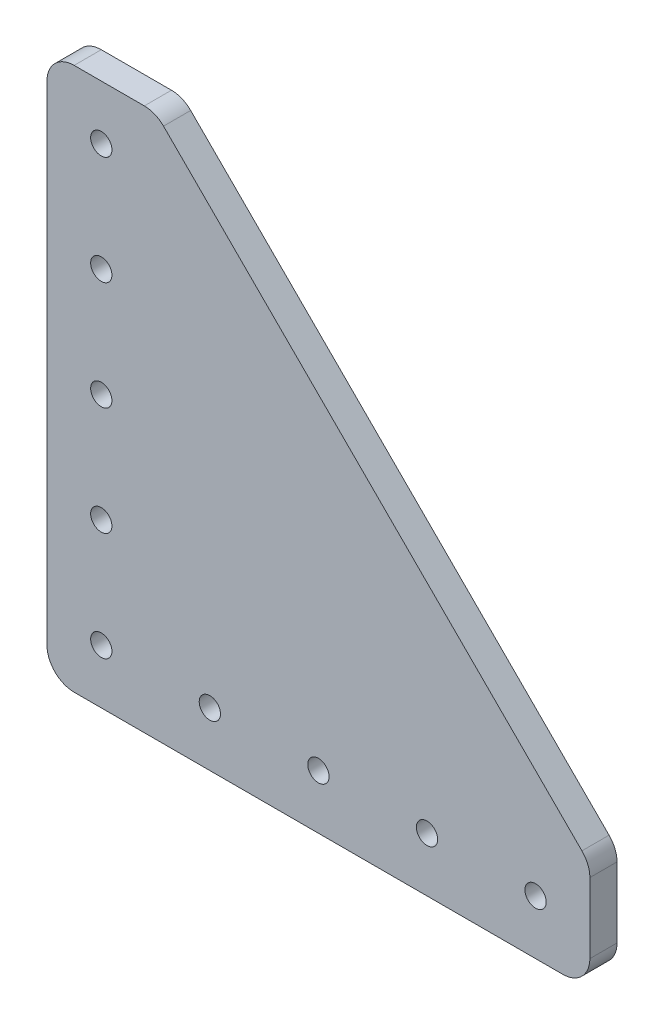
ISO-10303-21;
HEADER;
FILE_DESCRIPTION(('STEP AP214'),'2;1');
FILE_NAME('part.step','',(''),(''),'','','');
FILE_SCHEMA(('AUTOMOTIVE_DESIGN { 1 0 10303 214 1 1 1 1 }'));
ENDSEC;
DATA;
#1=APPLICATION_CONTEXT('core data for automotive mechanical design processes');
#2=APPLICATION_PROTOCOL_DEFINITION('international standard','automotive_design',2000,#1);
#3=PRODUCT_CONTEXT('',#1,'mechanical');
#4=PRODUCT('Part','Part','',(#3));
#5=PRODUCT_RELATED_PRODUCT_CATEGORY('part','',(#4));
#6=PRODUCT_DEFINITION_FORMATION('','',#4);
#7=PRODUCT_DEFINITION_CONTEXT('part definition',#1,'design');
#8=PRODUCT_DEFINITION('design','',#6,#7);
#9=PRODUCT_DEFINITION_SHAPE('','',#8);
#10=(LENGTH_UNIT() NAMED_UNIT(*) SI_UNIT(.MILLI.,.METRE.));
#11=(NAMED_UNIT(*) PLANE_ANGLE_UNIT() SI_UNIT($,.RADIAN.));
#12=(NAMED_UNIT(*) SI_UNIT($,.STERADIAN.) SOLID_ANGLE_UNIT());
#13=UNCERTAINTY_MEASURE_WITH_UNIT(LENGTH_MEASURE(1.E-05),#10,'distance_accuracy_value','');
#14=(GEOMETRIC_REPRESENTATION_CONTEXT(3) GLOBAL_UNCERTAINTY_ASSIGNED_CONTEXT((#13)) GLOBAL_UNIT_ASSIGNED_CONTEXT((#10,
#11,#12)) REPRESENTATION_CONTEXT('',''));
#15=CARTESIAN_POINT('',(0.,0.,0.));
#16=DIRECTION('',(0.,0.,1.));
#17=DIRECTION('',(1.,0.,0.));
#18=AXIS2_PLACEMENT_3D('',#15,#16,#17);
#19=CARTESIAN_POINT('',(127.,0.,6.35));
#20=DIRECTION('',(1.,0.,0.));
#21=DIRECTION('',(0.,0.,-1.));
#22=AXIS2_PLACEMENT_3D('',#19,#20,#21);
#23=PLANE('',#22);
#24=DIRECTION('',(0.,-1.,0.));
#25=VECTOR('',#24,1.);
#26=CARTESIAN_POINT('',(127.,0.,6.35));
#27=LINE('',#26,#25);
#28=CARTESIAN_POINT('',(127.,22.7697438789308,6.35));
#29=VERTEX_POINT('',#28);
#30=CARTESIAN_POINT('',(127.,6.34999999999999,6.35));
#31=VERTEX_POINT('',#30);
#32=EDGE_CURVE('E186',#29,#31,#27,.T.);
#33=ORIENTED_EDGE('',*,*,#32,.T.);
#34=DIRECTION('',(0.,0.,-1.));
#35=VECTOR('',#34,1.);
#36=CARTESIAN_POINT('',(127.,6.34999999999999,6.35));
#37=LINE('',#36,#35);
#38=CARTESIAN_POINT('',(127.,6.34999999999999,0.));
#39=VERTEX_POINT('',#38);
#40=EDGE_CURVE('E129',#31,#39,#37,.T.);
#41=ORIENTED_EDGE('',*,*,#40,.T.);
#42=DIRECTION('',(0.,-1.,0.));
#43=VECTOR('',#42,1.);
#44=CARTESIAN_POINT('',(127.,0.,0.));
#45=LINE('',#44,#43);
#46=CARTESIAN_POINT('',(127.,22.7697438789308,0.));
#47=VERTEX_POINT('',#46);
#48=EDGE_CURVE('E121',#47,#39,#45,.T.);
#49=ORIENTED_EDGE('',*,*,#48,.F.);
#50=DIRECTION('',(0.,0.,-1.));
#51=VECTOR('',#50,1.);
#52=CARTESIAN_POINT('',(127.,22.7697438789308,6.35));
#53=LINE('',#52,#51);
#54=EDGE_CURVE('E134',#47,#29,#53,.F.);
#55=ORIENTED_EDGE('',*,*,#54,.T.);
#56=EDGE_LOOP('',(#33,#41,#49,#55));
#57=FACE_BOUND('',#56,.T.);
#58=ADVANCED_FACE('F39',(#57),#23,.T.);
#59=CARTESIAN_POINT('',(76.2,76.2,6.35));
#60=DIRECTION('',(0.707106781186547,0.707106781186548,0.));
#61=DIRECTION('',(-0.707106781186548,0.707106781186547,0.));
#62=AXIS2_PLACEMENT_3D('',#59,#60,#61);
#63=PLANE('',#62);
#64=DIRECTION('',(0.707106781186548,-0.707106781186547,0.));
#65=VECTOR('',#64,1.);
#66=CARTESIAN_POINT('',(76.2,76.2,0.));
#67=LINE('',#66,#65);
#68=CARTESIAN_POINT('',(27.2598719394654,125.140128060535,0.));
#69=VERTEX_POINT('',#68);
#70=CARTESIAN_POINT('',(125.140128060535,27.2598719394654,0.));
#71=VERTEX_POINT('',#70);
#72=EDGE_CURVE('E123',#69,#71,#67,.T.);
#73=ORIENTED_EDGE('',*,*,#72,.F.);
#74=DIRECTION('',(0.,0.,-1.));
#75=VECTOR('',#74,1.);
#76=CARTESIAN_POINT('',(27.2598719394654,125.140128060535,6.35));
#77=LINE('',#76,#75);
#78=CARTESIAN_POINT('',(27.2598719394654,125.140128060535,6.35));
#79=VERTEX_POINT('',#78);
#80=EDGE_CURVE('E11',#69,#79,#77,.F.);
#81=ORIENTED_EDGE('',*,*,#80,.T.);
#82=DIRECTION('',(0.707106781186548,-0.707106781186547,0.));
#83=VECTOR('',#82,1.);
#84=CARTESIAN_POINT('',(76.2,76.2,6.35));
#85=LINE('',#84,#83);
#86=CARTESIAN_POINT('',(125.140128060535,27.2598719394654,6.35));
#87=VERTEX_POINT('',#86);
#88=EDGE_CURVE('E183',#79,#87,#85,.T.);
#89=ORIENTED_EDGE('',*,*,#88,.T.);
#90=DIRECTION('',(0.,0.,-1.));
#91=VECTOR('',#90,1.);
#92=CARTESIAN_POINT('',(125.140128060535,27.2598719394654,6.35));
#93=LINE('',#92,#91);
#94=EDGE_CURVE('E47',#87,#71,#93,.T.);
#95=ORIENTED_EDGE('',*,*,#94,.T.);
#96=EDGE_LOOP('',(#73,#81,#89,#95));
#97=FACE_BOUND('',#96,.T.);
#98=ADVANCED_FACE('F180',(#97),#63,.T.);
#99=CARTESIAN_POINT('',(1.38777878078145E-13,127.,6.35));
#100=DIRECTION('',(0.,1.,0.));
#101=DIRECTION('',(-1.,0.,0.));
#102=AXIS2_PLACEMENT_3D('',#99,#100,#101);
#103=PLANE('',#102);
#104=DIRECTION('',(1.,0.,0.));
#105=VECTOR('',#104,1.);
#106=CARTESIAN_POINT('',(1.38777878078145E-13,127.,0.));
#107=LINE('',#106,#105);
#108=CARTESIAN_POINT('',(6.34999999999998,127.,0.));
#109=VERTEX_POINT('',#108);
#110=CARTESIAN_POINT('',(22.7697438789308,127.,0.));
#111=VERTEX_POINT('',#110);
#112=EDGE_CURVE('E221',#109,#111,#107,.T.);
#113=ORIENTED_EDGE('',*,*,#112,.F.);
#114=DIRECTION('',(0.,0.,-1.));
#115=VECTOR('',#114,1.);
#116=CARTESIAN_POINT('',(6.34999999999998,127.,6.35));
#117=LINE('',#116,#115);
#118=CARTESIAN_POINT('',(6.34999999999998,127.,6.35));
#119=VERTEX_POINT('',#118);
#120=EDGE_CURVE('E177',#109,#119,#117,.F.);
#121=ORIENTED_EDGE('',*,*,#120,.T.);
#122=DIRECTION('',(1.,0.,0.));
#123=VECTOR('',#122,1.);
#124=CARTESIAN_POINT('',(1.38777878078145E-13,127.,6.35));
#125=LINE('',#124,#123);
#126=CARTESIAN_POINT('',(22.7697438789308,127.,6.35));
#127=VERTEX_POINT('',#126);
#128=EDGE_CURVE('E185',#119,#127,#125,.T.);
#129=ORIENTED_EDGE('',*,*,#128,.T.);
#130=DIRECTION('',(0.,0.,-1.));
#131=VECTOR('',#130,1.);
#132=CARTESIAN_POINT('',(22.7697438789308,127.,6.35));
#133=LINE('',#132,#131);
#134=EDGE_CURVE('E174',#127,#111,#133,.T.);
#135=ORIENTED_EDGE('',*,*,#134,.T.);
#136=EDGE_LOOP('',(#113,#121,#129,#135));
#137=FACE_BOUND('',#136,.T.);
#138=ADVANCED_FACE('F279',(#137),#103,.T.);
#139=CARTESIAN_POINT('',(0.,0.,6.35));
#140=DIRECTION('',(-1.,0.,0.));
#141=DIRECTION('',(0.,-1.,0.));
#142=AXIS2_PLACEMENT_3D('',#139,#140,#141);
#143=PLANE('',#142);
#144=DIRECTION('',(0.,1.,0.));
#145=VECTOR('',#144,1.);
#146=CARTESIAN_POINT('',(0.,0.,0.));
#147=LINE('',#146,#145);
#148=CARTESIAN_POINT('',(0.,6.35,0.));
#149=VERTEX_POINT('',#148);
#150=CARTESIAN_POINT('',(0.,120.65,0.));
#151=VERTEX_POINT('',#150);
#152=EDGE_CURVE('E224',#149,#151,#147,.T.);
#153=ORIENTED_EDGE('',*,*,#152,.F.);
#154=DIRECTION('',(0.,0.,-1.));
#155=VECTOR('',#154,1.);
#156=CARTESIAN_POINT('',(0.,6.35,6.35));
#157=LINE('',#156,#155);
#158=CARTESIAN_POINT('',(0.,6.35,6.35));
#159=VERTEX_POINT('',#158);
#160=EDGE_CURVE('E61',#149,#159,#157,.F.);
#161=ORIENTED_EDGE('',*,*,#160,.T.);
#162=DIRECTION('',(0.,1.,0.));
#163=VECTOR('',#162,1.);
#164=CARTESIAN_POINT('',(0.,0.,6.35));
#165=LINE('',#164,#163);
#166=CARTESIAN_POINT('',(0.,120.65,6.35));
#167=VERTEX_POINT('',#166);
#168=EDGE_CURVE('E189',#159,#167,#165,.T.);
#169=ORIENTED_EDGE('',*,*,#168,.T.);
#170=DIRECTION('',(0.,0.,-1.));
#171=VECTOR('',#170,1.);
#172=CARTESIAN_POINT('',(0.,120.65,6.35));
#173=LINE('',#172,#171);
#174=EDGE_CURVE('E170',#167,#151,#173,.T.);
#175=ORIENTED_EDGE('',*,*,#174,.T.);
#176=EDGE_LOOP('',(#153,#161,#169,#175));
#177=FACE_BOUND('',#176,.T.);
#178=ADVANCED_FACE('F307',(#177),#143,.T.);
#179=CARTESIAN_POINT('',(38.1,12.7,6.35));
#180=DIRECTION('',(0.,0.,-1.));
#181=DIRECTION('',(-1.,0.,0.));
#182=AXIS2_PLACEMENT_3D('',#179,#180,#181);
#183=CYLINDRICAL_SURFACE('',#182,2.4892);
#184=CARTESIAN_POINT('',(38.1,12.7,6.35));
#185=DIRECTION('',(0.,0.,1.));
#186=DIRECTION('',(1.,0.,0.));
#187=AXIS2_PLACEMENT_3D('',#184,#185,#186);
#188=CIRCLE('',#187,2.4892);
#189=CARTESIAN_POINT('',(40.5892,12.7,6.35));
#190=VERTEX_POINT('',#189);
#191=EDGE_CURVE('E144',#190,#190,#188,.T.);
#192=ORIENTED_EDGE('',*,*,#191,.T.);
#193=EDGE_LOOP('',(#192));
#194=FACE_BOUND('',#193,.T.);
#195=CARTESIAN_POINT('',(38.1,12.7,0.));
#196=DIRECTION('',(0.,0.,1.));
#197=DIRECTION('',(1.,0.,0.));
#198=AXIS2_PLACEMENT_3D('',#195,#196,#197);
#199=CIRCLE('',#198,2.4892);
#200=CARTESIAN_POINT('',(40.5892,12.7,0.));
#201=VERTEX_POINT('',#200);
#202=EDGE_CURVE('E250',#201,#201,#199,.T.);
#203=ORIENTED_EDGE('',*,*,#202,.F.);
#204=EDGE_LOOP('',(#203));
#205=FACE_BOUND('',#204,.T.);
#206=ADVANCED_FACE('F314',(#194,#205),#183,.F.);
#207=CARTESIAN_POINT('',(63.5,12.7,6.35));
#208=DIRECTION('',(0.,0.,-1.));
#209=DIRECTION('',(-1.,0.,0.));
#210=AXIS2_PLACEMENT_3D('',#207,#208,#209);
#211=CYLINDRICAL_SURFACE('',#210,2.4892);
#212=CARTESIAN_POINT('',(63.5,12.7,6.35));
#213=DIRECTION('',(0.,0.,1.));
#214=DIRECTION('',(1.,0.,0.));
#215=AXIS2_PLACEMENT_3D('',#212,#213,#214);
#216=CIRCLE('',#215,2.4892);
#217=CARTESIAN_POINT('',(65.9892,12.7,6.35));
#218=VERTEX_POINT('',#217);
#219=EDGE_CURVE('E215',#218,#218,#216,.T.);
#220=ORIENTED_EDGE('',*,*,#219,.T.);
#221=EDGE_LOOP('',(#220));
#222=FACE_BOUND('',#221,.T.);
#223=CARTESIAN_POINT('',(63.5,12.7,0.));
#224=DIRECTION('',(0.,0.,1.));
#225=DIRECTION('',(1.,0.,0.));
#226=AXIS2_PLACEMENT_3D('',#223,#224,#225);
#227=CIRCLE('',#226,2.4892);
#228=CARTESIAN_POINT('',(65.9892,12.7,0.));
#229=VERTEX_POINT('',#228);
#230=EDGE_CURVE('E248',#229,#229,#227,.T.);
#231=ORIENTED_EDGE('',*,*,#230,.F.);
#232=EDGE_LOOP('',(#231));
#233=FACE_BOUND('',#232,.T.);
#234=ADVANCED_FACE('F320',(#222,#233),#211,.F.);
#235=CARTESIAN_POINT('',(12.7,38.1,6.35));
#236=DIRECTION('',(0.,0.,-1.));
#237=DIRECTION('',(-1.,0.,0.));
#238=AXIS2_PLACEMENT_3D('',#235,#236,#237);
#239=CYLINDRICAL_SURFACE('',#238,2.4892);
#240=CARTESIAN_POINT('',(12.7,38.1,6.35));
#241=DIRECTION('',(0.,0.,1.));
#242=DIRECTION('',(1.,0.,0.));
#243=AXIS2_PLACEMENT_3D('',#240,#241,#242);
#244=CIRCLE('',#243,2.4892);
#245=CARTESIAN_POINT('',(15.1892,38.1,6.35));
#246=VERTEX_POINT('',#245);
#247=EDGE_CURVE('E212',#246,#246,#244,.T.);
#248=ORIENTED_EDGE('',*,*,#247,.T.);
#249=EDGE_LOOP('',(#248));
#250=FACE_BOUND('',#249,.T.);
#251=CARTESIAN_POINT('',(12.7,38.1,0.));
#252=DIRECTION('',(0.,0.,1.));
#253=DIRECTION('',(1.,0.,0.));
#254=AXIS2_PLACEMENT_3D('',#251,#252,#253);
#255=CIRCLE('',#254,2.4892);
#256=CARTESIAN_POINT('',(15.1892,38.1,0.));
#257=VERTEX_POINT('',#256);
#258=EDGE_CURVE('E245',#257,#257,#255,.T.);
#259=ORIENTED_EDGE('',*,*,#258,.F.);
#260=EDGE_LOOP('',(#259));
#261=FACE_BOUND('',#260,.T.);
#262=ADVANCED_FACE('F341',(#250,#261),#239,.F.);
#263=CARTESIAN_POINT('',(12.7,63.5,6.35));
#264=DIRECTION('',(0.,0.,-1.));
#265=DIRECTION('',(-1.,0.,0.));
#266=AXIS2_PLACEMENT_3D('',#263,#264,#265);
#267=CYLINDRICAL_SURFACE('',#266,2.4892);
#268=CARTESIAN_POINT('',(12.7,63.5,6.35));
#269=DIRECTION('',(0.,0.,1.));
#270=DIRECTION('',(1.,0.,0.));
#271=AXIS2_PLACEMENT_3D('',#268,#269,#270);
#272=CIRCLE('',#271,2.4892);
#273=CARTESIAN_POINT('',(15.1892,63.5,6.35));
#274=VERTEX_POINT('',#273);
#275=EDGE_CURVE('E209',#274,#274,#272,.T.);
#276=ORIENTED_EDGE('',*,*,#275,.T.);
#277=EDGE_LOOP('',(#276));
#278=FACE_BOUND('',#277,.T.);
#279=CARTESIAN_POINT('',(12.7,63.5,0.));
#280=DIRECTION('',(0.,0.,1.));
#281=DIRECTION('',(1.,0.,0.));
#282=AXIS2_PLACEMENT_3D('',#279,#280,#281);
#283=CIRCLE('',#282,2.4892);
#284=CARTESIAN_POINT('',(15.1892,63.5,0.));
#285=VERTEX_POINT('',#284);
#286=EDGE_CURVE('E242',#285,#285,#283,.T.);
#287=ORIENTED_EDGE('',*,*,#286,.F.);
#288=EDGE_LOOP('',(#287));
#289=FACE_BOUND('',#288,.T.);
#290=ADVANCED_FACE('F337',(#278,#289),#267,.F.);
#291=CARTESIAN_POINT('',(12.7,88.9,6.35));
#292=DIRECTION('',(0.,0.,-1.));
#293=DIRECTION('',(-1.,0.,0.));
#294=AXIS2_PLACEMENT_3D('',#291,#292,#293);
#295=CYLINDRICAL_SURFACE('',#294,2.4892);
#296=CARTESIAN_POINT('',(12.7,88.9,6.35));
#297=DIRECTION('',(0.,0.,1.));
#298=DIRECTION('',(1.,0.,0.));
#299=AXIS2_PLACEMENT_3D('',#296,#297,#298);
#300=CIRCLE('',#299,2.4892);
#301=CARTESIAN_POINT('',(15.1892,88.9,6.35));
#302=VERTEX_POINT('',#301);
#303=EDGE_CURVE('E206',#302,#302,#300,.T.);
#304=ORIENTED_EDGE('',*,*,#303,.T.);
#305=EDGE_LOOP('',(#304));
#306=FACE_BOUND('',#305,.T.);
#307=CARTESIAN_POINT('',(12.7,88.9,0.));
#308=DIRECTION('',(0.,0.,1.));
#309=DIRECTION('',(1.,0.,0.));
#310=AXIS2_PLACEMENT_3D('',#307,#308,#309);
#311=CIRCLE('',#310,2.4892);
#312=CARTESIAN_POINT('',(15.1892,88.9,0.));
#313=VERTEX_POINT('',#312);
#314=EDGE_CURVE('E239',#313,#313,#311,.T.);
#315=ORIENTED_EDGE('',*,*,#314,.F.);
#316=EDGE_LOOP('',(#315));
#317=FACE_BOUND('',#316,.T.);
#318=ADVANCED_FACE('F333',(#306,#317),#295,.F.);
#319=CARTESIAN_POINT('',(12.7,114.3,6.35));
#320=DIRECTION('',(0.,0.,-1.));
#321=DIRECTION('',(-1.,0.,0.));
#322=AXIS2_PLACEMENT_3D('',#319,#320,#321);
#323=CYLINDRICAL_SURFACE('',#322,2.4892);
#324=CARTESIAN_POINT('',(12.7,114.3,6.35));
#325=DIRECTION('',(0.,0.,1.));
#326=DIRECTION('',(1.,0.,0.));
#327=AXIS2_PLACEMENT_3D('',#324,#325,#326);
#328=CIRCLE('',#327,2.4892);
#329=CARTESIAN_POINT('',(15.1892,114.3,6.35));
#330=VERTEX_POINT('',#329);
#331=EDGE_CURVE('E203',#330,#330,#328,.T.);
#332=ORIENTED_EDGE('',*,*,#331,.T.);
#333=EDGE_LOOP('',(#332));
#334=FACE_BOUND('',#333,.T.);
#335=CARTESIAN_POINT('',(12.7,114.3,0.));
#336=DIRECTION('',(0.,0.,1.));
#337=DIRECTION('',(1.,0.,0.));
#338=AXIS2_PLACEMENT_3D('',#335,#336,#337);
#339=CIRCLE('',#338,2.4892);
#340=CARTESIAN_POINT('',(15.1892,114.3,0.));
#341=VERTEX_POINT('',#340);
#342=EDGE_CURVE('E236',#341,#341,#339,.T.);
#343=ORIENTED_EDGE('',*,*,#342,.F.);
#344=EDGE_LOOP('',(#343));
#345=FACE_BOUND('',#344,.T.);
#346=ADVANCED_FACE('F329',(#334,#345),#323,.F.);
#347=CARTESIAN_POINT('',(88.9,12.7,6.35));
#348=DIRECTION('',(0.,0.,-1.));
#349=DIRECTION('',(-1.,0.,0.));
#350=AXIS2_PLACEMENT_3D('',#347,#348,#349);
#351=CYLINDRICAL_SURFACE('',#350,2.4892);
#352=CARTESIAN_POINT('',(88.9,12.7,6.35));
#353=DIRECTION('',(0.,0.,1.));
#354=DIRECTION('',(1.,0.,0.));
#355=AXIS2_PLACEMENT_3D('',#352,#353,#354);
#356=CIRCLE('',#355,2.4892);
#357=CARTESIAN_POINT('',(91.3892,12.7,6.35));
#358=VERTEX_POINT('',#357);
#359=EDGE_CURVE('E200',#358,#358,#356,.T.);
#360=ORIENTED_EDGE('',*,*,#359,.T.);
#361=EDGE_LOOP('',(#360));
#362=FACE_BOUND('',#361,.T.);
#363=CARTESIAN_POINT('',(88.9,12.7,0.));
#364=DIRECTION('',(0.,0.,1.));
#365=DIRECTION('',(1.,0.,0.));
#366=AXIS2_PLACEMENT_3D('',#363,#364,#365);
#367=CIRCLE('',#366,2.4892);
#368=CARTESIAN_POINT('',(91.3892,12.7,0.));
#369=VERTEX_POINT('',#368);
#370=EDGE_CURVE('E233',#369,#369,#367,.T.);
#371=ORIENTED_EDGE('',*,*,#370,.F.);
#372=EDGE_LOOP('',(#371));
#373=FACE_BOUND('',#372,.T.);
#374=ADVANCED_FACE('F325',(#362,#373),#351,.F.);
#375=CARTESIAN_POINT('',(114.3,12.7,6.35));
#376=DIRECTION('',(0.,0.,-1.));
#377=DIRECTION('',(-1.,0.,0.));
#378=AXIS2_PLACEMENT_3D('',#375,#376,#377);
#379=CYLINDRICAL_SURFACE('',#378,2.4892);
#380=CARTESIAN_POINT('',(114.3,12.7,6.35));
#381=DIRECTION('',(0.,0.,1.));
#382=DIRECTION('',(1.,0.,0.));
#383=AXIS2_PLACEMENT_3D('',#380,#381,#382);
#384=CIRCLE('',#383,2.4892);
#385=CARTESIAN_POINT('',(116.7892,12.7,6.35));
#386=VERTEX_POINT('',#385);
#387=EDGE_CURVE('E197',#386,#386,#384,.T.);
#388=ORIENTED_EDGE('',*,*,#387,.T.);
#389=EDGE_LOOP('',(#388));
#390=FACE_BOUND('',#389,.T.);
#391=CARTESIAN_POINT('',(114.3,12.7,0.));
#392=DIRECTION('',(0.,0.,1.));
#393=DIRECTION('',(1.,0.,0.));
#394=AXIS2_PLACEMENT_3D('',#391,#392,#393);
#395=CIRCLE('',#394,2.4892);
#396=CARTESIAN_POINT('',(116.7892,12.7,0.));
#397=VERTEX_POINT('',#396);
#398=EDGE_CURVE('E230',#397,#397,#395,.T.);
#399=ORIENTED_EDGE('',*,*,#398,.F.);
#400=EDGE_LOOP('',(#399));
#401=FACE_BOUND('',#400,.T.);
#402=ADVANCED_FACE('F269',(#390,#401),#379,.F.);
#403=CARTESIAN_POINT('',(0.,0.,6.35));
#404=DIRECTION('',(0.,-1.,0.));
#405=DIRECTION('',(1.,0.,0.));
#406=AXIS2_PLACEMENT_3D('',#403,#404,#405);
#407=PLANE('',#406);
#408=DIRECTION('',(-1.,0.,0.));
#409=VECTOR('',#408,1.);
#410=CARTESIAN_POINT('',(0.,0.,0.));
#411=LINE('',#410,#409);
#412=CARTESIAN_POINT('',(120.65,0.,0.));
#413=VERTEX_POINT('',#412);
#414=CARTESIAN_POINT('',(6.35,0.,0.));
#415=VERTEX_POINT('',#414);
#416=EDGE_CURVE('E227',#413,#415,#411,.T.);
#417=ORIENTED_EDGE('',*,*,#416,.F.);
#418=DIRECTION('',(0.,0.,-1.));
#419=VECTOR('',#418,1.);
#420=CARTESIAN_POINT('',(120.65,0.,6.35));
#421=LINE('',#420,#419);
#422=CARTESIAN_POINT('',(120.65,0.,6.35));
#423=VERTEX_POINT('',#422);
#424=EDGE_CURVE('E160',#413,#423,#421,.F.);
#425=ORIENTED_EDGE('',*,*,#424,.T.);
#426=DIRECTION('',(-1.,0.,0.));
#427=VECTOR('',#426,1.);
#428=CARTESIAN_POINT('',(0.,0.,6.35));
#429=LINE('',#428,#427);
#430=CARTESIAN_POINT('',(6.35,0.,6.35));
#431=VERTEX_POINT('',#430);
#432=EDGE_CURVE('E194',#423,#431,#429,.T.);
#433=ORIENTED_EDGE('',*,*,#432,.T.);
#434=DIRECTION('',(0.,0.,-1.));
#435=VECTOR('',#434,1.);
#436=CARTESIAN_POINT('',(6.35,0.,6.35));
#437=LINE('',#436,#435);
#438=EDGE_CURVE('E157',#431,#415,#437,.T.);
#439=ORIENTED_EDGE('',*,*,#438,.T.);
#440=EDGE_LOOP('',(#417,#425,#433,#439));
#441=FACE_BOUND('',#440,.T.);
#442=ADVANCED_FACE('F261',(#441),#407,.T.);
#443=CARTESIAN_POINT('',(12.7,12.7,6.35));
#444=DIRECTION('',(0.,0.,-1.));
#445=DIRECTION('',(-1.,0.,0.));
#446=AXIS2_PLACEMENT_3D('',#443,#444,#445);
#447=CYLINDRICAL_SURFACE('',#446,2.4892);
#448=CARTESIAN_POINT('',(12.7,12.7,6.35));
#449=DIRECTION('',(0.,0.,1.));
#450=DIRECTION('',(1.,0.,0.));
#451=AXIS2_PLACEMENT_3D('',#448,#449,#450);
#452=CIRCLE('',#451,2.4892);
#453=CARTESIAN_POINT('',(15.1892,12.7,6.35));
#454=VERTEX_POINT('',#453);
#455=EDGE_CURVE('E140',#454,#454,#452,.T.);
#456=ORIENTED_EDGE('',*,*,#455,.T.);
#457=EDGE_LOOP('',(#456));
#458=FACE_BOUND('',#457,.T.);
#459=CARTESIAN_POINT('',(12.7,12.7,0.));
#460=DIRECTION('',(0.,0.,1.));
#461=DIRECTION('',(1.,0.,0.));
#462=AXIS2_PLACEMENT_3D('',#459,#460,#461);
#463=CIRCLE('',#462,2.4892);
#464=CARTESIAN_POINT('',(15.1892,12.7,0.));
#465=VERTEX_POINT('',#464);
#466=EDGE_CURVE('E147',#465,#465,#463,.T.);
#467=ORIENTED_EDGE('',*,*,#466,.F.);
#468=EDGE_LOOP('',(#467));
#469=FACE_BOUND('',#468,.T.);
#470=ADVANCED_FACE('F258',(#458,#469),#447,.F.);
#471=CARTESIAN_POINT('',(0.,0.,6.35));
#472=DIRECTION('',(0.,0.,1.));
#473=DIRECTION('',(1.,0.,0.));
#474=AXIS2_PLACEMENT_3D('',#471,#472,#473);
#475=PLANE('',#474);
#476=ORIENTED_EDGE('',*,*,#432,.F.);
#477=CARTESIAN_POINT('',(120.65,6.34999999999999,6.35));
#478=DIRECTION('',(0.,0.,1.));
#479=DIRECTION('',(1.,0.,0.));
#480=AXIS2_PLACEMENT_3D('',#477,#478,#479);
#481=CIRCLE('',#480,6.35);
#482=EDGE_CURVE('E168',#423,#31,#481,.T.);
#483=ORIENTED_EDGE('',*,*,#482,.T.);
#484=ORIENTED_EDGE('',*,*,#32,.F.);
#485=CARTESIAN_POINT('',(120.65,22.7697438789308,6.35));
#486=DIRECTION('',(0.,0.,1.));
#487=DIRECTION('',(1.,0.,0.));
#488=AXIS2_PLACEMENT_3D('',#485,#486,#487);
#489=CIRCLE('',#488,6.35);
#490=EDGE_CURVE('E139',#29,#87,#489,.T.);
#491=ORIENTED_EDGE('',*,*,#490,.T.);
#492=ORIENTED_EDGE('',*,*,#88,.F.);
#493=CARTESIAN_POINT('',(22.7697438789308,120.65,6.35));
#494=DIRECTION('',(0.,0.,1.));
#495=DIRECTION('',(1.,0.,0.));
#496=AXIS2_PLACEMENT_3D('',#493,#494,#495);
#497=CIRCLE('',#496,6.35);
#498=EDGE_CURVE('E163',#79,#127,#497,.T.);
#499=ORIENTED_EDGE('',*,*,#498,.T.);
#500=ORIENTED_EDGE('',*,*,#128,.F.);
#501=CARTESIAN_POINT('',(6.34999999999998,120.65,6.35));
#502=DIRECTION('',(0.,0.,1.));
#503=DIRECTION('',(1.,0.,0.));
#504=AXIS2_PLACEMENT_3D('',#501,#502,#503);
#505=CIRCLE('',#504,6.35);
#506=EDGE_CURVE('E54',#119,#167,#505,.T.);
#507=ORIENTED_EDGE('',*,*,#506,.T.);
#508=ORIENTED_EDGE('',*,*,#168,.F.);
#509=CARTESIAN_POINT('',(6.35,6.35,6.35));
#510=DIRECTION('',(0.,0.,1.));
#511=DIRECTION('',(1.,0.,0.));
#512=AXIS2_PLACEMENT_3D('',#509,#510,#511);
#513=CIRCLE('',#512,6.35);
#514=EDGE_CURVE('E166',#159,#431,#513,.T.);
#515=ORIENTED_EDGE('',*,*,#514,.T.);
#516=EDGE_LOOP('',(#476,#483,#484,#491,#492,#499,#500,#507,#508,#515));
#517=FACE_BOUND('',#516,.T.);
#518=ORIENTED_EDGE('',*,*,#387,.F.);
#519=EDGE_LOOP('',(#518));
#520=FACE_BOUND('',#519,.T.);
#521=ORIENTED_EDGE('',*,*,#359,.F.);
#522=EDGE_LOOP('',(#521));
#523=FACE_BOUND('',#522,.T.);
#524=ORIENTED_EDGE('',*,*,#331,.F.);
#525=EDGE_LOOP('',(#524));
#526=FACE_BOUND('',#525,.T.);
#527=ORIENTED_EDGE('',*,*,#303,.F.);
#528=EDGE_LOOP('',(#527));
#529=FACE_BOUND('',#528,.T.);
#530=ORIENTED_EDGE('',*,*,#275,.F.);
#531=EDGE_LOOP('',(#530));
#532=FACE_BOUND('',#531,.T.);
#533=ORIENTED_EDGE('',*,*,#247,.F.);
#534=EDGE_LOOP('',(#533));
#535=FACE_BOUND('',#534,.T.);
#536=ORIENTED_EDGE('',*,*,#219,.F.);
#537=EDGE_LOOP('',(#536));
#538=FACE_BOUND('',#537,.T.);
#539=ORIENTED_EDGE('',*,*,#191,.F.);
#540=EDGE_LOOP('',(#539));
#541=FACE_BOUND('',#540,.T.);
#542=ORIENTED_EDGE('',*,*,#455,.F.);
#543=EDGE_LOOP('',(#542));
#544=FACE_BOUND('',#543,.T.);
#545=ADVANCED_FACE('F260',(#517,#520,#523,#526,#529,#532,#535,#538,#541,#544),#475,.T.);
#546=CARTESIAN_POINT('',(0.,0.,0.));
#547=DIRECTION('',(0.,0.,1.));
#548=DIRECTION('',(1.,0.,0.));
#549=AXIS2_PLACEMENT_3D('',#546,#547,#548);
#550=PLANE('',#549);
#551=ORIENTED_EDGE('',*,*,#48,.T.);
#552=CARTESIAN_POINT('',(120.65,6.34999999999999,0.));
#553=DIRECTION('',(0.,0.,1.));
#554=DIRECTION('',(1.,0.,0.));
#555=AXIS2_PLACEMENT_3D('',#552,#553,#554);
#556=CIRCLE('',#555,6.35);
#557=EDGE_CURVE('E155',#39,#413,#556,.F.);
#558=ORIENTED_EDGE('',*,*,#557,.T.);
#559=ORIENTED_EDGE('',*,*,#416,.T.);
#560=CARTESIAN_POINT('',(6.35,6.35,0.));
#561=DIRECTION('',(0.,0.,1.));
#562=DIRECTION('',(1.,0.,0.));
#563=AXIS2_PLACEMENT_3D('',#560,#561,#562);
#564=CIRCLE('',#563,6.35);
#565=EDGE_CURVE('E153',#415,#149,#564,.F.);
#566=ORIENTED_EDGE('',*,*,#565,.T.);
#567=ORIENTED_EDGE('',*,*,#152,.T.);
#568=CARTESIAN_POINT('',(6.34999999999998,120.65,0.));
#569=DIRECTION('',(0.,0.,1.));
#570=DIRECTION('',(1.,0.,0.));
#571=AXIS2_PLACEMENT_3D('',#568,#569,#570);
#572=CIRCLE('',#571,6.35);
#573=EDGE_CURVE('E151',#151,#109,#572,.F.);
#574=ORIENTED_EDGE('',*,*,#573,.T.);
#575=ORIENTED_EDGE('',*,*,#112,.T.);
#576=CARTESIAN_POINT('',(22.7697438789308,120.65,0.));
#577=DIRECTION('',(0.,0.,1.));
#578=DIRECTION('',(1.,0.,0.));
#579=AXIS2_PLACEMENT_3D('',#576,#577,#578);
#580=CIRCLE('',#579,6.35);
#581=EDGE_CURVE('E128',#111,#69,#580,.F.);
#582=ORIENTED_EDGE('',*,*,#581,.T.);
#583=ORIENTED_EDGE('',*,*,#72,.T.);
#584=CARTESIAN_POINT('',(120.65,22.7697438789308,0.));
#585=DIRECTION('',(0.,0.,1.));
#586=DIRECTION('',(1.,0.,0.));
#587=AXIS2_PLACEMENT_3D('',#584,#585,#586);
#588=CIRCLE('',#587,6.35);
#589=EDGE_CURVE('E117',#71,#47,#588,.F.);
#590=ORIENTED_EDGE('',*,*,#589,.T.);
#591=EDGE_LOOP('',(#551,#558,#559,#566,#567,#574,#575,#582,#583,#590));
#592=FACE_BOUND('',#591,.T.);
#593=ORIENTED_EDGE('',*,*,#398,.T.);
#594=EDGE_LOOP('',(#593));
#595=FACE_BOUND('',#594,.T.);
#596=ORIENTED_EDGE('',*,*,#370,.T.);
#597=EDGE_LOOP('',(#596));
#598=FACE_BOUND('',#597,.T.);
#599=ORIENTED_EDGE('',*,*,#342,.T.);
#600=EDGE_LOOP('',(#599));
#601=FACE_BOUND('',#600,.T.);
#602=ORIENTED_EDGE('',*,*,#314,.T.);
#603=EDGE_LOOP('',(#602));
#604=FACE_BOUND('',#603,.T.);
#605=ORIENTED_EDGE('',*,*,#286,.T.);
#606=EDGE_LOOP('',(#605));
#607=FACE_BOUND('',#606,.T.);
#608=ORIENTED_EDGE('',*,*,#258,.T.);
#609=EDGE_LOOP('',(#608));
#610=FACE_BOUND('',#609,.T.);
#611=ORIENTED_EDGE('',*,*,#230,.T.);
#612=EDGE_LOOP('',(#611));
#613=FACE_BOUND('',#612,.T.);
#614=ORIENTED_EDGE('',*,*,#202,.T.);
#615=EDGE_LOOP('',(#614));
#616=FACE_BOUND('',#615,.T.);
#617=ORIENTED_EDGE('',*,*,#466,.T.);
#618=EDGE_LOOP('',(#617));
#619=FACE_BOUND('',#618,.T.);
#620=ADVANCED_FACE('F119',(#592,#595,#598,#601,#604,#607,#610,#613,#616,#619),#550,.F.);
#621=CARTESIAN_POINT('',(120.65,6.34999999999999,6.35));
#622=DIRECTION('',(0.,0.,-1.));
#623=DIRECTION('',(-1.,0.,0.));
#624=AXIS2_PLACEMENT_3D('',#621,#622,#623);
#625=CYLINDRICAL_SURFACE('',#624,6.35);
#626=ORIENTED_EDGE('',*,*,#482,.F.);
#627=ORIENTED_EDGE('',*,*,#424,.F.);
#628=ORIENTED_EDGE('',*,*,#557,.F.);
#629=ORIENTED_EDGE('',*,*,#40,.F.);
#630=EDGE_LOOP('',(#626,#627,#628,#629));
#631=FACE_BOUND('',#630,.T.);
#632=ADVANCED_FACE('F283',(#631),#625,.T.);
#633=CARTESIAN_POINT('',(6.35,6.35,6.35));
#634=DIRECTION('',(0.,0.,-1.));
#635=DIRECTION('',(-1.,0.,0.));
#636=AXIS2_PLACEMENT_3D('',#633,#634,#635);
#637=CYLINDRICAL_SURFACE('',#636,6.35);
#638=ORIENTED_EDGE('',*,*,#514,.F.);
#639=ORIENTED_EDGE('',*,*,#160,.F.);
#640=ORIENTED_EDGE('',*,*,#565,.F.);
#641=ORIENTED_EDGE('',*,*,#438,.F.);
#642=EDGE_LOOP('',(#638,#639,#640,#641));
#643=FACE_BOUND('',#642,.T.);
#644=ADVANCED_FACE('F286',(#643),#637,.T.);
#645=CARTESIAN_POINT('',(6.34999999999998,120.65,6.35));
#646=DIRECTION('',(0.,0.,-1.));
#647=DIRECTION('',(-1.,0.,0.));
#648=AXIS2_PLACEMENT_3D('',#645,#646,#647);
#649=CYLINDRICAL_SURFACE('',#648,6.35);
#650=ORIENTED_EDGE('',*,*,#506,.F.);
#651=ORIENTED_EDGE('',*,*,#120,.F.);
#652=ORIENTED_EDGE('',*,*,#573,.F.);
#653=ORIENTED_EDGE('',*,*,#174,.F.);
#654=EDGE_LOOP('',(#650,#651,#652,#653));
#655=FACE_BOUND('',#654,.T.);
#656=ADVANCED_FACE('F290',(#655),#649,.T.);
#657=CARTESIAN_POINT('',(22.7697438789308,120.65,6.35));
#658=DIRECTION('',(0.,0.,-1.));
#659=DIRECTION('',(-1.,0.,0.));
#660=AXIS2_PLACEMENT_3D('',#657,#658,#659);
#661=CYLINDRICAL_SURFACE('',#660,6.35);
#662=ORIENTED_EDGE('',*,*,#498,.F.);
#663=ORIENTED_EDGE('',*,*,#80,.F.);
#664=ORIENTED_EDGE('',*,*,#581,.F.);
#665=ORIENTED_EDGE('',*,*,#134,.F.);
#666=EDGE_LOOP('',(#662,#663,#664,#665));
#667=FACE_BOUND('',#666,.T.);
#668=ADVANCED_FACE('F293',(#667),#661,.T.);
#669=CARTESIAN_POINT('',(120.65,22.7697438789308,6.35));
#670=DIRECTION('',(0.,0.,-1.));
#671=DIRECTION('',(-1.,0.,0.));
#672=AXIS2_PLACEMENT_3D('',#669,#670,#671);
#673=CYLINDRICAL_SURFACE('',#672,6.35);
#674=ORIENTED_EDGE('',*,*,#490,.F.);
#675=ORIENTED_EDGE('',*,*,#54,.F.);
#676=ORIENTED_EDGE('',*,*,#589,.F.);
#677=ORIENTED_EDGE('',*,*,#94,.F.);
#678=EDGE_LOOP('',(#674,#675,#676,#677));
#679=FACE_BOUND('',#678,.T.);
#680=ADVANCED_FACE('F41',(#679),#673,.T.);
#681=CLOSED_SHELL('',(#58,#98,#138,#178,#206,#234,#262,#290,#318,#346,#374,#402,#442,#470,#545,
#620,#632,#644,#656,#668,#680));
#682=MANIFOLD_SOLID_BREP('B2',#681);
#683=ADVANCED_BREP_SHAPE_REPRESENTATION('',(#18,#682),#14);
#684=SHAPE_DEFINITION_REPRESENTATION(#9,#683);
ENDSEC;
END-ISO-10303-21;
